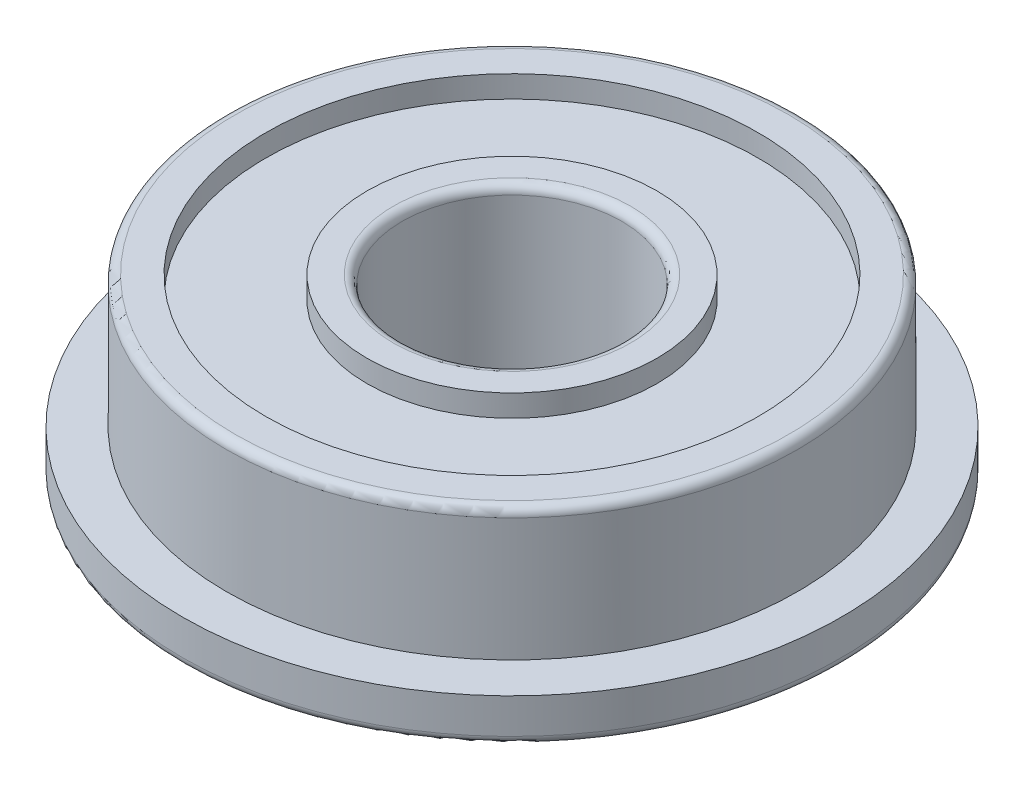
ISO-10303-21;
HEADER;
FILE_DESCRIPTION(('STEP AP214'),'2;1');
FILE_NAME('part.step','',(''),(''),'','','');
FILE_SCHEMA(('AUTOMOTIVE_DESIGN { 1 0 10303 214 1 1 1 1 }'));
ENDSEC;
DATA;
#1=APPLICATION_CONTEXT('core data for automotive mechanical design processes');
#2=APPLICATION_PROTOCOL_DEFINITION('international standard','automotive_design',2000,#1);
#3=PRODUCT_CONTEXT('',#1,'mechanical');
#4=PRODUCT('Part','Part','',(#3));
#5=PRODUCT_RELATED_PRODUCT_CATEGORY('part','',(#4));
#6=PRODUCT_DEFINITION_FORMATION('','',#4);
#7=PRODUCT_DEFINITION_CONTEXT('part definition',#1,'design');
#8=PRODUCT_DEFINITION('design','',#6,#7);
#9=PRODUCT_DEFINITION_SHAPE('','',#8);
#10=(LENGTH_UNIT() NAMED_UNIT(*) SI_UNIT(.MILLI.,.METRE.));
#11=(NAMED_UNIT(*) PLANE_ANGLE_UNIT() SI_UNIT($,.RADIAN.));
#12=(NAMED_UNIT(*) SI_UNIT($,.STERADIAN.) SOLID_ANGLE_UNIT());
#13=UNCERTAINTY_MEASURE_WITH_UNIT(LENGTH_MEASURE(1.E-05),#10,'distance_accuracy_value','');
#14=(GEOMETRIC_REPRESENTATION_CONTEXT(3) GLOBAL_UNCERTAINTY_ASSIGNED_CONTEXT((#13)) GLOBAL_UNIT_ASSIGNED_CONTEXT((#10,
#11,#12)) REPRESENTATION_CONTEXT('',''));
#15=CARTESIAN_POINT('',(0.,0.,0.));
#16=DIRECTION('',(0.,0.,1.));
#17=DIRECTION('',(1.,0.,0.));
#18=AXIS2_PLACEMENT_3D('',#15,#16,#17);
#19=CARTESIAN_POINT('',(0.,5.41217041093377,0.));
#20=DIRECTION('',(0.,1.,0.));
#21=DIRECTION('',(0.,0.,1.));
#22=AXIS2_PLACEMENT_3D('',#19,#20,#21);
#23=CYLINDRICAL_SURFACE('',#22,3.3);
#24=CARTESIAN_POINT('',(0.,0.,0.));
#25=DIRECTION('',(0.,1.,0.));
#26=DIRECTION('',(0.,0.,1.));
#27=AXIS2_PLACEMENT_3D('',#24,#25,#26);
#28=CIRCLE('',#27,3.3);
#29=CARTESIAN_POINT('',(0.,0.,3.3));
#30=VERTEX_POINT('',#29);
#31=EDGE_CURVE('E93',#30,#30,#28,.T.);
#32=ORIENTED_EDGE('',*,*,#31,.T.);
#33=EDGE_LOOP('',(#32));
#34=FACE_BOUND('',#33,.T.);
#35=CARTESIAN_POINT('',(0.,0.5,0.));
#36=DIRECTION('',(0.,1.,0.));
#37=DIRECTION('',(0.,0.,1.));
#38=AXIS2_PLACEMENT_3D('',#35,#36,#37);
#39=CIRCLE('',#38,3.3);
#40=CARTESIAN_POINT('',(0.,0.5,3.3));
#41=VERTEX_POINT('',#40);
#42=EDGE_CURVE('E66',#41,#41,#39,.T.);
#43=ORIENTED_EDGE('',*,*,#42,.F.);
#44=EDGE_LOOP('',(#43));
#45=FACE_BOUND('',#44,.T.);
#46=ADVANCED_FACE('F34',(#34,#45),#23,.T.);
#47=CARTESIAN_POINT('',(0.,0.500000000000001,0.));
#48=DIRECTION('',(0.,-1.,0.));
#49=DIRECTION('',(0.,0.,-1.));
#50=AXIS2_PLACEMENT_3D('',#47,#48,#49);
#51=PLANE('',#50);
#52=ORIENTED_EDGE('',*,*,#42,.T.);
#53=EDGE_LOOP('',(#52));
#54=FACE_BOUND('',#53,.T.);
#55=CARTESIAN_POINT('',(0.,0.500000000000001,0.));
#56=DIRECTION('',(0.,1.,0.));
#57=DIRECTION('',(0.,0.,1.));
#58=AXIS2_PLACEMENT_3D('',#55,#56,#57);
#59=CIRCLE('',#58,5.6);
#60=CARTESIAN_POINT('',(0.,0.500000000000001,5.6));
#61=VERTEX_POINT('',#60);
#62=EDGE_CURVE('E69',#61,#61,#59,.T.);
#63=ORIENTED_EDGE('',*,*,#62,.F.);
#64=EDGE_LOOP('',(#63));
#65=FACE_BOUND('',#64,.T.);
#66=ADVANCED_FACE('F121',(#54,#65),#51,.T.);
#67=CARTESIAN_POINT('',(0.,5.41217041093377,0.));
#68=DIRECTION('',(0.,1.,0.));
#69=DIRECTION('',(0.,0.,1.));
#70=AXIS2_PLACEMENT_3D('',#67,#68,#69);
#71=CYLINDRICAL_SURFACE('',#70,5.6);
#72=ORIENTED_EDGE('',*,*,#62,.T.);
#73=EDGE_LOOP('',(#72));
#74=FACE_BOUND('',#73,.T.);
#75=CARTESIAN_POINT('',(0.,0.,0.));
#76=DIRECTION('',(0.,1.,0.));
#77=DIRECTION('',(0.,0.,1.));
#78=AXIS2_PLACEMENT_3D('',#75,#76,#77);
#79=CIRCLE('',#78,5.6);
#80=CARTESIAN_POINT('',(0.,0.,5.6));
#81=VERTEX_POINT('',#80);
#82=EDGE_CURVE('E72',#81,#81,#79,.T.);
#83=ORIENTED_EDGE('',*,*,#82,.F.);
#84=EDGE_LOOP('',(#83));
#85=FACE_BOUND('',#84,.T.);
#86=ADVANCED_FACE('F118',(#74,#85),#71,.F.);
#87=CARTESIAN_POINT('',(0.,0.,0.));
#88=DIRECTION('',(0.,1.,0.));
#89=DIRECTION('',(0.,0.,1.));
#90=AXIS2_PLACEMENT_3D('',#87,#88,#89);
#91=PLANE('',#90);
#92=CARTESIAN_POINT('',(0.,0.,0.));
#93=DIRECTION('',(0.,1.,0.));
#94=DIRECTION('',(0.,0.,1.));
#95=AXIS2_PLACEMENT_3D('',#92,#93,#94);
#96=CIRCLE('',#95,7.3);
#97=CARTESIAN_POINT('',(0.,0.,7.3));
#98=VERTEX_POINT('',#97);
#99=EDGE_CURVE('E49',#98,#98,#96,.F.);
#100=ORIENTED_EDGE('',*,*,#99,.T.);
#101=EDGE_LOOP('',(#100));
#102=FACE_BOUND('',#101,.T.);
#103=ORIENTED_EDGE('',*,*,#82,.T.);
#104=EDGE_LOOP('',(#103));
#105=FACE_BOUND('',#104,.T.);
#106=ADVANCED_FACE('F105',(#102,#105),#91,.F.);
#107=CARTESIAN_POINT('',(0.,5.41217041093377,0.));
#108=DIRECTION('',(0.,1.,0.));
#109=DIRECTION('',(0.,0.,1.));
#110=AXIS2_PLACEMENT_3D('',#107,#108,#109);
#111=CYLINDRICAL_SURFACE('',#110,7.5);
#112=CARTESIAN_POINT('',(0.,0.2,0.));
#113=DIRECTION('',(0.,1.,0.));
#114=DIRECTION('',(0.,0.,1.));
#115=AXIS2_PLACEMENT_3D('',#112,#113,#114);
#116=CIRCLE('',#115,7.5);
#117=CARTESIAN_POINT('',(0.,0.2,7.5));
#118=VERTEX_POINT('',#117);
#119=EDGE_CURVE('E54',#118,#118,#116,.T.);
#120=ORIENTED_EDGE('',*,*,#119,.T.);
#121=EDGE_LOOP('',(#120));
#122=FACE_BOUND('',#121,.T.);
#123=CARTESIAN_POINT('',(0.,1.,0.));
#124=DIRECTION('',(0.,1.,0.));
#125=DIRECTION('',(0.,0.,1.));
#126=AXIS2_PLACEMENT_3D('',#123,#124,#125);
#127=CIRCLE('',#126,7.5);
#128=CARTESIAN_POINT('',(0.,1.,7.5));
#129=VERTEX_POINT('',#128);
#130=EDGE_CURVE('E75',#129,#129,#127,.T.);
#131=ORIENTED_EDGE('',*,*,#130,.F.);
#132=EDGE_LOOP('',(#131));
#133=FACE_BOUND('',#132,.T.);
#134=ADVANCED_FACE('F117',(#122,#133),#111,.T.);
#135=CARTESIAN_POINT('',(0.,1.,0.));
#136=DIRECTION('',(0.,-1.,0.));
#137=DIRECTION('',(0.,0.,-1.));
#138=AXIS2_PLACEMENT_3D('',#135,#136,#137);
#139=PLANE('',#138);
#140=CARTESIAN_POINT('',(0.,1.,0.));
#141=DIRECTION('',(0.,1.,0.));
#142=DIRECTION('',(0.,0.,1.));
#143=AXIS2_PLACEMENT_3D('',#140,#141,#142);
#144=CIRCLE('',#143,6.5);
#145=CARTESIAN_POINT('',(0.,1.,6.5));
#146=VERTEX_POINT('',#145);
#147=EDGE_CURVE('E78',#146,#146,#144,.T.);
#148=ORIENTED_EDGE('',*,*,#147,.F.);
#149=EDGE_LOOP('',(#148));
#150=FACE_BOUND('',#149,.T.);
#151=ORIENTED_EDGE('',*,*,#130,.T.);
#152=EDGE_LOOP('',(#151));
#153=FACE_BOUND('',#152,.T.);
#154=ADVANCED_FACE('F165',(#150,#153),#139,.F.);
#155=CARTESIAN_POINT('',(0.,5.41217041093377,0.));
#156=DIRECTION('',(0.,1.,0.));
#157=DIRECTION('',(0.,0.,1.));
#158=AXIS2_PLACEMENT_3D('',#155,#156,#157);
#159=CYLINDRICAL_SURFACE('',#158,6.5);
#160=CARTESIAN_POINT('',(0.,3.8,0.));
#161=DIRECTION('',(0.,-1.,0.));
#162=DIRECTION('',(0.,0.,-1.));
#163=AXIS2_PLACEMENT_3D('',#160,#161,#162);
#164=CIRCLE('',#163,6.5);
#165=CARTESIAN_POINT('',(0.,3.8,-6.5));
#166=VERTEX_POINT('',#165);
#167=EDGE_CURVE('E41',#166,#166,#164,.T.);
#168=ORIENTED_EDGE('',*,*,#167,.T.);
#169=EDGE_LOOP('',(#168));
#170=FACE_BOUND('',#169,.T.);
#171=ORIENTED_EDGE('',*,*,#147,.T.);
#172=EDGE_LOOP('',(#171));
#173=FACE_BOUND('',#172,.T.);
#174=ADVANCED_FACE('F146',(#170,#173),#159,.T.);
#175=CARTESIAN_POINT('',(0.,4.,0.));
#176=DIRECTION('',(0.,-1.,0.));
#177=DIRECTION('',(0.,0.,-1.));
#178=AXIS2_PLACEMENT_3D('',#175,#176,#177);
#179=PLANE('',#178);
#180=CARTESIAN_POINT('',(0.,4.,0.));
#181=DIRECTION('',(0.,-1.,0.));
#182=DIRECTION('',(0.,0.,-1.));
#183=AXIS2_PLACEMENT_3D('',#180,#181,#182);
#184=CIRCLE('',#183,6.3);
#185=CARTESIAN_POINT('',(0.,4.,-6.3));
#186=VERTEX_POINT('',#185);
#187=EDGE_CURVE('E45',#186,#186,#184,.F.);
#188=ORIENTED_EDGE('',*,*,#187,.T.);
#189=EDGE_LOOP('',(#188));
#190=FACE_BOUND('',#189,.T.);
#191=CARTESIAN_POINT('',(0.,4.,0.));
#192=DIRECTION('',(0.,1.,0.));
#193=DIRECTION('',(0.,0.,1.));
#194=AXIS2_PLACEMENT_3D('',#191,#192,#193);
#195=CIRCLE('',#194,5.6);
#196=CARTESIAN_POINT('',(0.,4.,5.6));
#197=VERTEX_POINT('',#196);
#198=EDGE_CURVE('E81',#197,#197,#195,.T.);
#199=ORIENTED_EDGE('',*,*,#198,.F.);
#200=EDGE_LOOP('',(#199));
#201=FACE_BOUND('',#200,.T.);
#202=ADVANCED_FACE('F142',(#190,#201),#179,.F.);
#203=CARTESIAN_POINT('',(0.,5.41217041093377,0.));
#204=DIRECTION('',(0.,1.,0.));
#205=DIRECTION('',(0.,0.,1.));
#206=AXIS2_PLACEMENT_3D('',#203,#204,#205);
#207=CYLINDRICAL_SURFACE('',#206,5.6);
#208=CARTESIAN_POINT('',(0.,3.5,0.));
#209=DIRECTION('',(0.,1.,0.));
#210=DIRECTION('',(0.,0.,1.));
#211=AXIS2_PLACEMENT_3D('',#208,#209,#210);
#212=CIRCLE('',#211,5.6);
#213=CARTESIAN_POINT('',(0.,3.5,5.6));
#214=VERTEX_POINT('',#213);
#215=EDGE_CURVE('E84',#214,#214,#212,.T.);
#216=ORIENTED_EDGE('',*,*,#215,.F.);
#217=EDGE_LOOP('',(#216));
#218=FACE_BOUND('',#217,.T.);
#219=ORIENTED_EDGE('',*,*,#198,.T.);
#220=EDGE_LOOP('',(#219));
#221=FACE_BOUND('',#220,.T.);
#222=ADVANCED_FACE('F145',(#218,#221),#207,.F.);
#223=CARTESIAN_POINT('',(0.,3.5,0.));
#224=DIRECTION('',(0.,-1.,0.));
#225=DIRECTION('',(0.,0.,-1.));
#226=AXIS2_PLACEMENT_3D('',#223,#224,#225);
#227=PLANE('',#226);
#228=CARTESIAN_POINT('',(0.,3.5,0.));
#229=DIRECTION('',(0.,1.,0.));
#230=DIRECTION('',(0.,0.,1.));
#231=AXIS2_PLACEMENT_3D('',#228,#229,#230);
#232=CIRCLE('',#231,3.3);
#233=CARTESIAN_POINT('',(0.,3.5,3.3));
#234=VERTEX_POINT('',#233);
#235=EDGE_CURVE('E87',#234,#234,#232,.T.);
#236=ORIENTED_EDGE('',*,*,#235,.F.);
#237=EDGE_LOOP('',(#236));
#238=FACE_BOUND('',#237,.T.);
#239=ORIENTED_EDGE('',*,*,#215,.T.);
#240=EDGE_LOOP('',(#239));
#241=FACE_BOUND('',#240,.T.);
#242=ADVANCED_FACE('F151',(#238,#241),#227,.F.);
#243=CARTESIAN_POINT('',(0.,5.41217041093377,0.));
#244=DIRECTION('',(0.,1.,0.));
#245=DIRECTION('',(0.,0.,1.));
#246=AXIS2_PLACEMENT_3D('',#243,#244,#245);
#247=CYLINDRICAL_SURFACE('',#246,3.3);
#248=CARTESIAN_POINT('',(0.,4.,0.));
#249=DIRECTION('',(0.,1.,0.));
#250=DIRECTION('',(0.,0.,1.));
#251=AXIS2_PLACEMENT_3D('',#248,#249,#250);
#252=CIRCLE('',#251,3.3);
#253=CARTESIAN_POINT('',(0.,4.,3.3));
#254=VERTEX_POINT('',#253);
#255=EDGE_CURVE('E90',#254,#254,#252,.T.);
#256=ORIENTED_EDGE('',*,*,#255,.F.);
#257=EDGE_LOOP('',(#256));
#258=FACE_BOUND('',#257,.T.);
#259=ORIENTED_EDGE('',*,*,#235,.T.);
#260=EDGE_LOOP('',(#259));
#261=FACE_BOUND('',#260,.T.);
#262=ADVANCED_FACE('F157',(#258,#261),#247,.T.);
#263=CARTESIAN_POINT('',(0.,4.,0.));
#264=DIRECTION('',(0.,-1.,0.));
#265=DIRECTION('',(0.,0.,-1.));
#266=AXIS2_PLACEMENT_3D('',#263,#264,#265);
#267=PLANE('',#266);
#268=CARTESIAN_POINT('',(0.,4.,0.));
#269=DIRECTION('',(0.,-1.,0.));
#270=DIRECTION('',(0.,0.,-1.));
#271=AXIS2_PLACEMENT_3D('',#268,#269,#270);
#272=CIRCLE('',#271,2.7);
#273=CARTESIAN_POINT('',(0.,4.,-2.7));
#274=VERTEX_POINT('',#273);
#275=EDGE_CURVE('E10',#274,#274,#272,.T.);
#276=ORIENTED_EDGE('',*,*,#275,.T.);
#277=EDGE_LOOP('',(#276));
#278=FACE_BOUND('',#277,.T.);
#279=ORIENTED_EDGE('',*,*,#255,.T.);
#280=EDGE_LOOP('',(#279));
#281=FACE_BOUND('',#280,.T.);
#282=ADVANCED_FACE('F113',(#278,#281),#267,.F.);
#283=CARTESIAN_POINT('',(0.,5.41217041093377,0.));
#284=DIRECTION('',(0.,1.,0.));
#285=DIRECTION('',(0.,0.,1.));
#286=AXIS2_PLACEMENT_3D('',#283,#284,#285);
#287=CYLINDRICAL_SURFACE('',#286,2.5);
#288=CARTESIAN_POINT('',(0.,0.2,0.));
#289=DIRECTION('',(0.,1.,0.));
#290=DIRECTION('',(0.,0.,1.));
#291=AXIS2_PLACEMENT_3D('',#288,#289,#290);
#292=CIRCLE('',#291,2.5);
#293=CARTESIAN_POINT('',(0.,0.2,2.5));
#294=VERTEX_POINT('',#293);
#295=EDGE_CURVE('E57',#294,#294,#292,.F.);
#296=ORIENTED_EDGE('',*,*,#295,.T.);
#297=EDGE_LOOP('',(#296));
#298=FACE_BOUND('',#297,.T.);
#299=CARTESIAN_POINT('',(0.,3.8,0.));
#300=DIRECTION('',(0.,-1.,0.));
#301=DIRECTION('',(0.,0.,-1.));
#302=AXIS2_PLACEMENT_3D('',#299,#300,#301);
#303=CIRCLE('',#302,2.5);
#304=CARTESIAN_POINT('',(0.,3.8,-2.5));
#305=VERTEX_POINT('',#304);
#306=EDGE_CURVE('E60',#305,#305,#303,.F.);
#307=ORIENTED_EDGE('',*,*,#306,.T.);
#308=EDGE_LOOP('',(#307));
#309=FACE_BOUND('',#308,.T.);
#310=ADVANCED_FACE('F102',(#298,#309),#287,.F.);
#311=CARTESIAN_POINT('',(0.,0.,0.));
#312=DIRECTION('',(0.,1.,0.));
#313=DIRECTION('',(0.,0.,1.));
#314=AXIS2_PLACEMENT_3D('',#311,#312,#313);
#315=CIRCLE('',#314,2.7);
#316=CARTESIAN_POINT('',(0.,0.,2.7));
#317=VERTEX_POINT('',#316);
#318=EDGE_CURVE('E63',#317,#317,#315,.T.);
#319=ORIENTED_EDGE('',*,*,#318,.T.);
#320=EDGE_LOOP('',(#319));
#321=FACE_BOUND('',#320,.T.);
#322=ORIENTED_EDGE('',*,*,#31,.F.);
#323=EDGE_LOOP('',(#322));
#324=FACE_BOUND('',#323,.T.);
#325=ADVANCED_FACE('F99',(#321,#324),#91,.F.);
#326=CARTESIAN_POINT('',(0.,0.2,0.));
#327=DIRECTION('',(0.,1.,0.));
#328=DIRECTION('',(0.,0.,1.));
#329=AXIS2_PLACEMENT_3D('',#326,#327,#328);
#330=TOROIDAL_SURFACE('',#329,2.7,0.2);
#331=ORIENTED_EDGE('',*,*,#295,.F.);
#332=EDGE_LOOP('',(#331));
#333=FACE_BOUND('',#332,.T.);
#334=ORIENTED_EDGE('',*,*,#318,.F.);
#335=EDGE_LOOP('',(#334));
#336=FACE_BOUND('',#335,.T.);
#337=ADVANCED_FACE('F101',(#333,#336),#330,.T.);
#338=CARTESIAN_POINT('',(0.,0.2,0.));
#339=DIRECTION('',(0.,1.,0.));
#340=DIRECTION('',(0.,0.,1.));
#341=AXIS2_PLACEMENT_3D('',#338,#339,#340);
#342=TOROIDAL_SURFACE('',#341,7.3,0.2);
#343=ORIENTED_EDGE('',*,*,#99,.F.);
#344=EDGE_LOOP('',(#343));
#345=FACE_BOUND('',#344,.T.);
#346=ORIENTED_EDGE('',*,*,#119,.F.);
#347=EDGE_LOOP('',(#346));
#348=FACE_BOUND('',#347,.T.);
#349=ADVANCED_FACE('F110',(#345,#348),#342,.T.);
#350=CARTESIAN_POINT('',(0.,3.8,0.));
#351=DIRECTION('',(0.,-1.,0.));
#352=DIRECTION('',(0.,0.,-1.));
#353=AXIS2_PLACEMENT_3D('',#350,#351,#352);
#354=TOROIDAL_SURFACE('',#353,6.3,0.2);
#355=ORIENTED_EDGE('',*,*,#167,.F.);
#356=EDGE_LOOP('',(#355));
#357=FACE_BOUND('',#356,.T.);
#358=ORIENTED_EDGE('',*,*,#187,.F.);
#359=EDGE_LOOP('',(#358));
#360=FACE_BOUND('',#359,.T.);
#361=ADVANCED_FACE('F131',(#357,#360),#354,.T.);
#362=CARTESIAN_POINT('',(0.,3.8,0.));
#363=DIRECTION('',(0.,-1.,0.));
#364=DIRECTION('',(0.,0.,-1.));
#365=AXIS2_PLACEMENT_3D('',#362,#363,#364);
#366=TOROIDAL_SURFACE('',#365,2.7,0.2);
#367=ORIENTED_EDGE('',*,*,#275,.F.);
#368=EDGE_LOOP('',(#367));
#369=FACE_BOUND('',#368,.T.);
#370=ORIENTED_EDGE('',*,*,#306,.F.);
#371=EDGE_LOOP('',(#370));
#372=FACE_BOUND('',#371,.T.);
#373=ADVANCED_FACE('F36',(#369,#372),#366,.T.);
#374=CLOSED_SHELL('',(#46,#66,#86,#106,#134,#154,#174,#202,#222,#242,#262,#282,#310,#325,#337,
#349,#361,#373));
#375=MANIFOLD_SOLID_BREP('B2',#374);
#376=ADVANCED_BREP_SHAPE_REPRESENTATION('',(#18,#375),#14);
#377=SHAPE_DEFINITION_REPRESENTATION(#9,#376);
ENDSEC;
END-ISO-10303-21;
